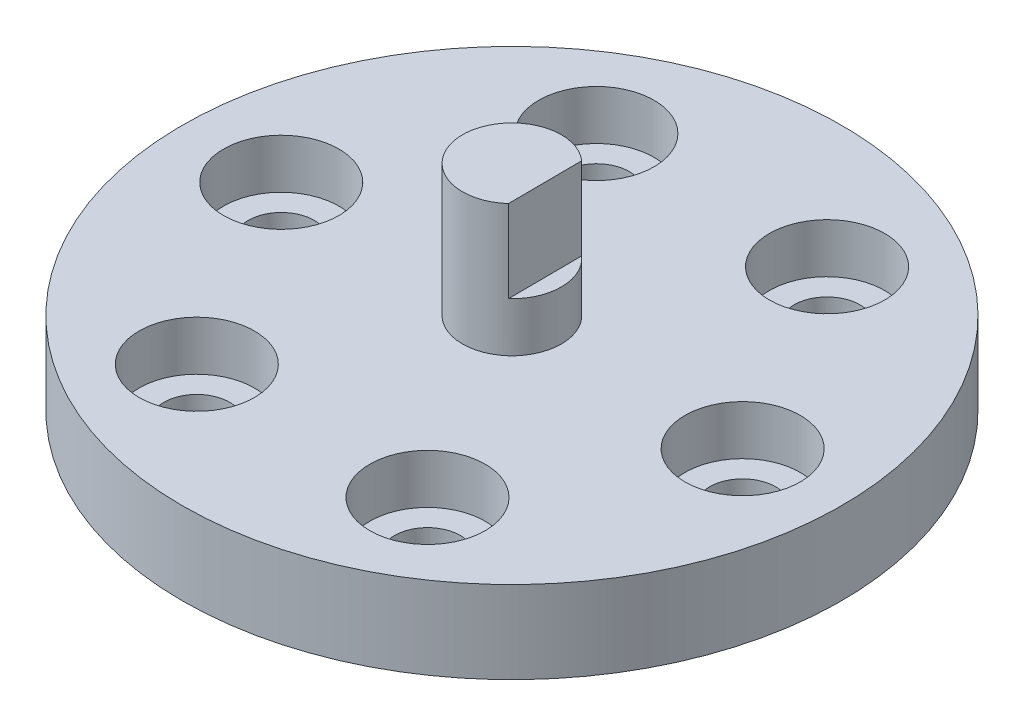
ISO-10303-21;
HEADER;
FILE_DESCRIPTION(('STEP AP214'),'2;1');
FILE_NAME('part.step','',(''),(''),'','','');
FILE_SCHEMA(('AUTOMOTIVE_DESIGN { 1 0 10303 214 1 1 1 1 }'));
ENDSEC;
DATA;
#1=APPLICATION_CONTEXT('core data for automotive mechanical design processes');
#2=APPLICATION_PROTOCOL_DEFINITION('international standard','automotive_design',2000,#1);
#3=PRODUCT_CONTEXT('',#1,'mechanical');
#4=PRODUCT('Part','Part','',(#3));
#5=PRODUCT_RELATED_PRODUCT_CATEGORY('part','',(#4));
#6=PRODUCT_DEFINITION_FORMATION('','',#4);
#7=PRODUCT_DEFINITION_CONTEXT('part definition',#1,'design');
#8=PRODUCT_DEFINITION('design','',#6,#7);
#9=PRODUCT_DEFINITION_SHAPE('','',#8);
#10=(LENGTH_UNIT() NAMED_UNIT(*) SI_UNIT(.MILLI.,.METRE.));
#11=(NAMED_UNIT(*) PLANE_ANGLE_UNIT() SI_UNIT($,.RADIAN.));
#12=(NAMED_UNIT(*) SI_UNIT($,.STERADIAN.) SOLID_ANGLE_UNIT());
#13=UNCERTAINTY_MEASURE_WITH_UNIT(LENGTH_MEASURE(1.E-05),#10,'distance_accuracy_value','');
#14=(GEOMETRIC_REPRESENTATION_CONTEXT(3) GLOBAL_UNCERTAINTY_ASSIGNED_CONTEXT((#13)) GLOBAL_UNIT_ASSIGNED_CONTEXT((#10,
#11,#12)) REPRESENTATION_CONTEXT('',''));
#15=CARTESIAN_POINT('',(0.,0.,0.));
#16=DIRECTION('',(0.,0.,1.));
#17=DIRECTION('',(1.,0.,0.));
#18=AXIS2_PLACEMENT_3D('',#15,#16,#17);
#19=CARTESIAN_POINT('',(6.99999999999997,0.,12.1243556529822));
#20=DIRECTION('',(0.,1.,0.));
#21=DIRECTION('',(0.,0.,1.));
#22=AXIS2_PLACEMENT_3D('',#19,#20,#21);
#23=CYLINDRICAL_SURFACE('',#22,2.);
#24=CARTESIAN_POINT('',(6.99999999999997,0.,12.1243556529822));
#25=DIRECTION('',(0.,1.,0.));
#26=DIRECTION('',(0.,0.,1.));
#27=AXIS2_PLACEMENT_3D('',#24,#25,#26);
#28=CIRCLE('',#27,2.);
#29=CARTESIAN_POINT('',(6.99999999999997,0.,14.1243556529822));
#30=VERTEX_POINT('',#29);
#31=EDGE_CURVE('E122',#30,#30,#28,.T.);
#32=ORIENTED_EDGE('',*,*,#31,.F.);
#33=EDGE_LOOP('',(#32));
#34=FACE_BOUND('',#33,.T.);
#35=CARTESIAN_POINT('',(6.99999999999997,2.,12.1243556529822));
#36=DIRECTION('',(0.,1.,0.));
#37=DIRECTION('',(0.,0.,1.));
#38=AXIS2_PLACEMENT_3D('',#35,#36,#37);
#39=CIRCLE('',#38,2.);
#40=CARTESIAN_POINT('',(6.99999999999997,2.,14.1243556529822));
#41=VERTEX_POINT('',#40);
#42=EDGE_CURVE('E40',#41,#41,#39,.F.);
#43=ORIENTED_EDGE('',*,*,#42,.F.);
#44=EDGE_LOOP('',(#43));
#45=FACE_BOUND('',#44,.T.);
#46=ADVANCED_FACE('F36',(#34,#45),#23,.F.);
#47=CARTESIAN_POINT('',(-7.00000000000006,0.,12.1243556529821));
#48=DIRECTION('',(0.,1.,0.));
#49=DIRECTION('',(0.,0.,1.));
#50=AXIS2_PLACEMENT_3D('',#47,#48,#49);
#51=CYLINDRICAL_SURFACE('',#50,2.);
#52=CARTESIAN_POINT('',(-7.00000000000006,0.,12.1243556529821));
#53=DIRECTION('',(0.,1.,0.));
#54=DIRECTION('',(0.,0.,1.));
#55=AXIS2_PLACEMENT_3D('',#52,#53,#54);
#56=CIRCLE('',#55,2.);
#57=CARTESIAN_POINT('',(-7.00000000000006,0.,14.1243556529821));
#58=VERTEX_POINT('',#57);
#59=EDGE_CURVE('E129',#58,#58,#56,.T.);
#60=ORIENTED_EDGE('',*,*,#59,.F.);
#61=EDGE_LOOP('',(#60));
#62=FACE_BOUND('',#61,.T.);
#63=CARTESIAN_POINT('',(-7.00000000000006,2.,12.1243556529821));
#64=DIRECTION('',(0.,1.,0.));
#65=DIRECTION('',(0.,0.,1.));
#66=AXIS2_PLACEMENT_3D('',#63,#64,#65);
#67=CIRCLE('',#66,2.);
#68=CARTESIAN_POINT('',(-7.00000000000006,2.,14.1243556529821));
#69=VERTEX_POINT('',#68);
#70=EDGE_CURVE('E151',#69,#69,#67,.F.);
#71=ORIENTED_EDGE('',*,*,#70,.F.);
#72=EDGE_LOOP('',(#71));
#73=FACE_BOUND('',#72,.T.);
#74=ADVANCED_FACE('F161',(#62,#73),#51,.F.);
#75=CARTESIAN_POINT('',(-14.,0.,0.));
#76=DIRECTION('',(0.,1.,0.));
#77=DIRECTION('',(0.,0.,1.));
#78=AXIS2_PLACEMENT_3D('',#75,#76,#77);
#79=CYLINDRICAL_SURFACE('',#78,2.);
#80=CARTESIAN_POINT('',(-14.,0.,0.));
#81=DIRECTION('',(0.,1.,0.));
#82=DIRECTION('',(0.,0.,1.));
#83=AXIS2_PLACEMENT_3D('',#80,#81,#82);
#84=CIRCLE('',#83,2.);
#85=CARTESIAN_POINT('',(-14.,0.,1.9999999999999));
#86=VERTEX_POINT('',#85);
#87=EDGE_CURVE('E132',#86,#86,#84,.T.);
#88=ORIENTED_EDGE('',*,*,#87,.F.);
#89=EDGE_LOOP('',(#88));
#90=FACE_BOUND('',#89,.T.);
#91=CARTESIAN_POINT('',(-14.,2.,0.));
#92=DIRECTION('',(0.,1.,0.));
#93=DIRECTION('',(0.,0.,1.));
#94=AXIS2_PLACEMENT_3D('',#91,#92,#93);
#95=CIRCLE('',#94,2.);
#96=CARTESIAN_POINT('',(-14.,2.,1.9999999999999));
#97=VERTEX_POINT('',#96);
#98=EDGE_CURVE('E149',#97,#97,#95,.F.);
#99=ORIENTED_EDGE('',*,*,#98,.F.);
#100=EDGE_LOOP('',(#99));
#101=FACE_BOUND('',#100,.T.);
#102=ADVANCED_FACE('F167',(#90,#101),#79,.F.);
#103=CARTESIAN_POINT('',(-6.99999999999989,0.,-12.1243556529822));
#104=DIRECTION('',(0.,1.,0.));
#105=DIRECTION('',(0.,0.,1.));
#106=AXIS2_PLACEMENT_3D('',#103,#104,#105);
#107=CYLINDRICAL_SURFACE('',#106,2.);
#108=CARTESIAN_POINT('',(-6.99999999999989,0.,-12.1243556529822));
#109=DIRECTION('',(0.,1.,0.));
#110=DIRECTION('',(0.,0.,1.));
#111=AXIS2_PLACEMENT_3D('',#108,#109,#110);
#112=CIRCLE('',#111,2.);
#113=CARTESIAN_POINT('',(-6.99999999999989,0.,-10.1243556529822));
#114=VERTEX_POINT('',#113);
#115=EDGE_CURVE('E126',#114,#114,#112,.T.);
#116=ORIENTED_EDGE('',*,*,#115,.F.);
#117=EDGE_LOOP('',(#116));
#118=FACE_BOUND('',#117,.T.);
#119=CARTESIAN_POINT('',(-6.99999999999989,2.,-12.1243556529822));
#120=DIRECTION('',(0.,1.,0.));
#121=DIRECTION('',(0.,0.,1.));
#122=AXIS2_PLACEMENT_3D('',#119,#120,#121);
#123=CIRCLE('',#122,2.);
#124=CARTESIAN_POINT('',(-6.99999999999989,2.,-10.1243556529822));
#125=VERTEX_POINT('',#124);
#126=EDGE_CURVE('E146',#125,#125,#123,.F.);
#127=ORIENTED_EDGE('',*,*,#126,.F.);
#128=EDGE_LOOP('',(#127));
#129=FACE_BOUND('',#128,.T.);
#130=ADVANCED_FACE('F177',(#118,#129),#107,.F.);
#131=CARTESIAN_POINT('',(7.00000000000014,0.,-12.1243556529821));
#132=DIRECTION('',(0.,1.,0.));
#133=DIRECTION('',(0.,0.,1.));
#134=AXIS2_PLACEMENT_3D('',#131,#132,#133);
#135=CYLINDRICAL_SURFACE('',#134,2.);
#136=CARTESIAN_POINT('',(7.00000000000014,0.,-12.1243556529821));
#137=DIRECTION('',(0.,1.,0.));
#138=DIRECTION('',(0.,0.,1.));
#139=AXIS2_PLACEMENT_3D('',#136,#137,#138);
#140=CIRCLE('',#139,2.);
#141=CARTESIAN_POINT('',(7.00000000000014,0.,-10.1243556529821));
#142=VERTEX_POINT('',#141);
#143=EDGE_CURVE('E123',#142,#142,#140,.T.);
#144=ORIENTED_EDGE('',*,*,#143,.F.);
#145=EDGE_LOOP('',(#144));
#146=FACE_BOUND('',#145,.T.);
#147=CARTESIAN_POINT('',(7.00000000000014,2.,-12.1243556529821));
#148=DIRECTION('',(0.,1.,0.));
#149=DIRECTION('',(0.,0.,1.));
#150=AXIS2_PLACEMENT_3D('',#147,#148,#149);
#151=CIRCLE('',#150,2.);
#152=CARTESIAN_POINT('',(7.00000000000014,2.,-10.1243556529821));
#153=VERTEX_POINT('',#152);
#154=EDGE_CURVE('E143',#153,#153,#151,.F.);
#155=ORIENTED_EDGE('',*,*,#154,.F.);
#156=EDGE_LOOP('',(#155));
#157=FACE_BOUND('',#156,.T.);
#158=ADVANCED_FACE('F172',(#146,#157),#135,.F.);
#159=CARTESIAN_POINT('',(14.,0.,0.));
#160=DIRECTION('',(0.,1.,0.));
#161=DIRECTION('',(0.,0.,1.));
#162=AXIS2_PLACEMENT_3D('',#159,#160,#161);
#163=CYLINDRICAL_SURFACE('',#162,2.);
#164=CARTESIAN_POINT('',(14.,0.,0.));
#165=DIRECTION('',(0.,1.,0.));
#166=DIRECTION('',(0.,0.,1.));
#167=AXIS2_PLACEMENT_3D('',#164,#165,#166);
#168=CIRCLE('',#167,2.);
#169=CARTESIAN_POINT('',(14.,0.,2.));
#170=VERTEX_POINT('',#169);
#171=EDGE_CURVE('E118',#170,#170,#168,.T.);
#172=ORIENTED_EDGE('',*,*,#171,.F.);
#173=EDGE_LOOP('',(#172));
#174=FACE_BOUND('',#173,.T.);
#175=CARTESIAN_POINT('',(14.,2.,0.));
#176=DIRECTION('',(0.,1.,0.));
#177=DIRECTION('',(0.,0.,1.));
#178=AXIS2_PLACEMENT_3D('',#175,#176,#177);
#179=CIRCLE('',#178,2.);
#180=CARTESIAN_POINT('',(14.,2.,2.));
#181=VERTEX_POINT('',#180);
#182=EDGE_CURVE('E115',#181,#181,#179,.F.);
#183=ORIENTED_EDGE('',*,*,#182,.F.);
#184=EDGE_LOOP('',(#183));
#185=FACE_BOUND('',#184,.T.);
#186=ADVANCED_FACE('F209',(#174,#185),#163,.F.);
#187=CARTESIAN_POINT('',(0.,5.,0.));
#188=DIRECTION('',(0.,-1.,0.));
#189=DIRECTION('',(0.,0.,-1.));
#190=AXIS2_PLACEMENT_3D('',#187,#188,#189);
#191=CYLINDRICAL_SURFACE('',#190,20.);
#192=CARTESIAN_POINT('',(0.,5.,0.));
#193=DIRECTION('',(0.,1.,0.));
#194=DIRECTION('',(0.,0.,1.));
#195=AXIS2_PLACEMENT_3D('',#192,#193,#194);
#196=CIRCLE('',#195,20.);
#197=CARTESIAN_POINT('',(0.,5.,20.));
#198=VERTEX_POINT('',#197);
#199=EDGE_CURVE('E45',#198,#198,#196,.T.);
#200=ORIENTED_EDGE('',*,*,#199,.F.);
#201=EDGE_LOOP('',(#200));
#202=FACE_BOUND('',#201,.T.);
#203=CARTESIAN_POINT('',(0.,0.,0.));
#204=DIRECTION('',(0.,1.,0.));
#205=DIRECTION('',(0.,0.,1.));
#206=AXIS2_PLACEMENT_3D('',#203,#204,#205);
#207=CIRCLE('',#206,20.);
#208=CARTESIAN_POINT('',(0.,0.,20.));
#209=VERTEX_POINT('',#208);
#210=EDGE_CURVE('E121',#209,#209,#207,.T.);
#211=ORIENTED_EDGE('',*,*,#210,.T.);
#212=EDGE_LOOP('',(#211));
#213=FACE_BOUND('',#212,.T.);
#214=ADVANCED_FACE('F38',(#202,#213),#191,.T.);
#215=CARTESIAN_POINT('',(0.,5.,0.));
#216=DIRECTION('',(0.,1.,0.));
#217=DIRECTION('',(0.,0.,1.));
#218=AXIS2_PLACEMENT_3D('',#215,#216,#217);
#219=PLANE('',#218);
#220=CARTESIAN_POINT('',(0.,5.,0.));
#221=DIRECTION('',(0.,1.,0.));
#222=DIRECTION('',(0.,0.,1.));
#223=AXIS2_PLACEMENT_3D('',#220,#221,#222);
#224=CIRCLE('',#223,3.);
#225=CARTESIAN_POINT('',(0.,5.,3.));
#226=VERTEX_POINT('',#225);
#227=EDGE_CURVE('E11',#226,#226,#224,.T.);
#228=ORIENTED_EDGE('',*,*,#227,.F.);
#229=EDGE_LOOP('',(#228));
#230=FACE_BOUND('',#229,.T.);
#231=CARTESIAN_POINT('',(6.99999999999997,5.,12.1243556529822));
#232=DIRECTION('',(0.,1.,0.));
#233=DIRECTION('',(0.,0.,1.));
#234=AXIS2_PLACEMENT_3D('',#231,#232,#233);
#235=CIRCLE('',#234,3.5);
#236=CARTESIAN_POINT('',(6.99999999999997,5.,15.6243556529822));
#237=VERTEX_POINT('',#236);
#238=EDGE_CURVE('E92',#237,#237,#235,.T.);
#239=ORIENTED_EDGE('',*,*,#238,.F.);
#240=EDGE_LOOP('',(#239));
#241=FACE_BOUND('',#240,.T.);
#242=CARTESIAN_POINT('',(-7.00000000000006,5.,12.1243556529821));
#243=DIRECTION('',(0.,1.,0.));
#244=DIRECTION('',(0.,0.,1.));
#245=AXIS2_PLACEMENT_3D('',#242,#243,#244);
#246=CIRCLE('',#245,3.5);
#247=CARTESIAN_POINT('',(-7.00000000000006,5.,15.6243556529821));
#248=VERTEX_POINT('',#247);
#249=EDGE_CURVE('E98',#248,#248,#246,.T.);
#250=ORIENTED_EDGE('',*,*,#249,.F.);
#251=EDGE_LOOP('',(#250));
#252=FACE_BOUND('',#251,.T.);
#253=CARTESIAN_POINT('',(-14.,5.,0.));
#254=DIRECTION('',(0.,1.,0.));
#255=DIRECTION('',(0.,0.,1.));
#256=AXIS2_PLACEMENT_3D('',#253,#254,#255);
#257=CIRCLE('',#256,3.5);
#258=CARTESIAN_POINT('',(-14.,5.,3.4999999999999));
#259=VERTEX_POINT('',#258);
#260=EDGE_CURVE('E104',#259,#259,#257,.T.);
#261=ORIENTED_EDGE('',*,*,#260,.F.);
#262=EDGE_LOOP('',(#261));
#263=FACE_BOUND('',#262,.T.);
#264=CARTESIAN_POINT('',(-6.99999999999989,5.,-12.1243556529822));
#265=DIRECTION('',(0.,1.,0.));
#266=DIRECTION('',(0.,0.,1.));
#267=AXIS2_PLACEMENT_3D('',#264,#265,#266);
#268=CIRCLE('',#267,3.5);
#269=CARTESIAN_POINT('',(-6.99999999999989,5.,-8.62435565298221));
#270=VERTEX_POINT('',#269);
#271=EDGE_CURVE('E86',#270,#270,#268,.T.);
#272=ORIENTED_EDGE('',*,*,#271,.F.);
#273=EDGE_LOOP('',(#272));
#274=FACE_BOUND('',#273,.T.);
#275=CARTESIAN_POINT('',(7.00000000000014,5.,-12.1243556529821));
#276=DIRECTION('',(0.,1.,0.));
#277=DIRECTION('',(0.,0.,1.));
#278=AXIS2_PLACEMENT_3D('',#275,#276,#277);
#279=CIRCLE('',#278,3.5);
#280=CARTESIAN_POINT('',(7.00000000000014,5.,-8.62435565298206));
#281=VERTEX_POINT('',#280);
#282=EDGE_CURVE('E78',#281,#281,#279,.T.);
#283=ORIENTED_EDGE('',*,*,#282,.F.);
#284=EDGE_LOOP('',(#283));
#285=FACE_BOUND('',#284,.T.);
#286=CARTESIAN_POINT('',(14.,5.,0.));
#287=DIRECTION('',(0.,1.,0.));
#288=DIRECTION('',(0.,0.,1.));
#289=AXIS2_PLACEMENT_3D('',#286,#287,#288);
#290=CIRCLE('',#289,3.5);
#291=CARTESIAN_POINT('',(14.,5.,3.5));
#292=VERTEX_POINT('',#291);
#293=EDGE_CURVE('E91',#292,#292,#290,.T.);
#294=ORIENTED_EDGE('',*,*,#293,.F.);
#295=EDGE_LOOP('',(#294));
#296=FACE_BOUND('',#295,.T.);
#297=ORIENTED_EDGE('',*,*,#199,.T.);
#298=EDGE_LOOP('',(#297));
#299=FACE_BOUND('',#298,.T.);
#300=ADVANCED_FACE('F182',(#230,#241,#252,#263,#274,#285,#296,#299),#219,.T.);
#301=CARTESIAN_POINT('',(0.,0.,0.));
#302=DIRECTION('',(0.,1.,0.));
#303=DIRECTION('',(0.,0.,1.));
#304=AXIS2_PLACEMENT_3D('',#301,#302,#303);
#305=PLANE('',#304);
#306=ORIENTED_EDGE('',*,*,#171,.T.);
#307=EDGE_LOOP('',(#306));
#308=FACE_BOUND('',#307,.T.);
#309=ORIENTED_EDGE('',*,*,#143,.T.);
#310=EDGE_LOOP('',(#309));
#311=FACE_BOUND('',#310,.T.);
#312=ORIENTED_EDGE('',*,*,#115,.T.);
#313=EDGE_LOOP('',(#312));
#314=FACE_BOUND('',#313,.T.);
#315=ORIENTED_EDGE('',*,*,#87,.T.);
#316=EDGE_LOOP('',(#315));
#317=FACE_BOUND('',#316,.T.);
#318=ORIENTED_EDGE('',*,*,#59,.T.);
#319=EDGE_LOOP('',(#318));
#320=FACE_BOUND('',#319,.T.);
#321=ORIENTED_EDGE('',*,*,#31,.T.);
#322=EDGE_LOOP('',(#321));
#323=FACE_BOUND('',#322,.T.);
#324=ORIENTED_EDGE('',*,*,#210,.F.);
#325=EDGE_LOOP('',(#324));
#326=FACE_BOUND('',#325,.T.);
#327=ADVANCED_FACE('F184',(#308,#311,#314,#317,#320,#323,#326),#305,.F.);
#328=CARTESIAN_POINT('',(14.,2.,0.));
#329=DIRECTION('',(0.,1.,0.));
#330=DIRECTION('',(0.,0.,1.));
#331=AXIS2_PLACEMENT_3D('',#328,#329,#330);
#332=PLANE('',#331);
#333=CARTESIAN_POINT('',(14.,2.,0.));
#334=DIRECTION('',(0.,1.,0.));
#335=DIRECTION('',(0.,0.,1.));
#336=AXIS2_PLACEMENT_3D('',#333,#334,#335);
#337=CIRCLE('',#336,3.5);
#338=CARTESIAN_POINT('',(14.,2.,3.5));
#339=VERTEX_POINT('',#338);
#340=EDGE_CURVE('E112',#339,#339,#337,.T.);
#341=ORIENTED_EDGE('',*,*,#340,.T.);
#342=EDGE_LOOP('',(#341));
#343=FACE_BOUND('',#342,.T.);
#344=ORIENTED_EDGE('',*,*,#182,.T.);
#345=EDGE_LOOP('',(#344));
#346=FACE_BOUND('',#345,.T.);
#347=ADVANCED_FACE('F187',(#343,#346),#332,.T.);
#348=CARTESIAN_POINT('',(14.,2.,0.));
#349=DIRECTION('',(0.,1.,0.));
#350=DIRECTION('',(0.,0.,1.));
#351=AXIS2_PLACEMENT_3D('',#348,#349,#350);
#352=CYLINDRICAL_SURFACE('',#351,3.5);
#353=ORIENTED_EDGE('',*,*,#340,.F.);
#354=EDGE_LOOP('',(#353));
#355=FACE_BOUND('',#354,.T.);
#356=ORIENTED_EDGE('',*,*,#293,.T.);
#357=EDGE_LOOP('',(#356));
#358=FACE_BOUND('',#357,.T.);
#359=ADVANCED_FACE('F192',(#355,#358),#352,.F.);
#360=CARTESIAN_POINT('',(7.00000000000014,2.,-12.1243556529821));
#361=DIRECTION('',(0.,1.,0.));
#362=DIRECTION('',(0.,0.,1.));
#363=AXIS2_PLACEMENT_3D('',#360,#361,#362);
#364=PLANE('',#363);
#365=CARTESIAN_POINT('',(7.00000000000014,2.,-12.1243556529821));
#366=DIRECTION('',(0.,1.,0.));
#367=DIRECTION('',(0.,0.,1.));
#368=AXIS2_PLACEMENT_3D('',#365,#366,#367);
#369=CIRCLE('',#368,3.5);
#370=CARTESIAN_POINT('',(7.00000000000014,2.,-8.62435565298206));
#371=VERTEX_POINT('',#370);
#372=EDGE_CURVE('E81',#371,#371,#369,.T.);
#373=ORIENTED_EDGE('',*,*,#372,.T.);
#374=EDGE_LOOP('',(#373));
#375=FACE_BOUND('',#374,.T.);
#376=ORIENTED_EDGE('',*,*,#154,.T.);
#377=EDGE_LOOP('',(#376));
#378=FACE_BOUND('',#377,.T.);
#379=ADVANCED_FACE('F224',(#375,#378),#364,.T.);
#380=CARTESIAN_POINT('',(7.00000000000014,2.,-12.1243556529821));
#381=DIRECTION('',(0.,1.,0.));
#382=DIRECTION('',(0.,0.,1.));
#383=AXIS2_PLACEMENT_3D('',#380,#381,#382);
#384=CYLINDRICAL_SURFACE('',#383,3.5);
#385=ORIENTED_EDGE('',*,*,#372,.F.);
#386=EDGE_LOOP('',(#385));
#387=FACE_BOUND('',#386,.T.);
#388=ORIENTED_EDGE('',*,*,#282,.T.);
#389=EDGE_LOOP('',(#388));
#390=FACE_BOUND('',#389,.T.);
#391=ADVANCED_FACE('F235',(#387,#390),#384,.F.);
#392=CARTESIAN_POINT('',(-6.99999999999989,2.,-12.1243556529822));
#393=DIRECTION('',(0.,1.,0.));
#394=DIRECTION('',(0.,0.,1.));
#395=AXIS2_PLACEMENT_3D('',#392,#393,#394);
#396=PLANE('',#395);
#397=CARTESIAN_POINT('',(-6.99999999999989,2.,-12.1243556529822));
#398=DIRECTION('',(0.,1.,0.));
#399=DIRECTION('',(0.,0.,1.));
#400=AXIS2_PLACEMENT_3D('',#397,#398,#399);
#401=CIRCLE('',#400,3.5);
#402=CARTESIAN_POINT('',(-6.99999999999989,2.,-8.62435565298221));
#403=VERTEX_POINT('',#402);
#404=EDGE_CURVE('E107',#403,#403,#401,.T.);
#405=ORIENTED_EDGE('',*,*,#404,.T.);
#406=EDGE_LOOP('',(#405));
#407=FACE_BOUND('',#406,.T.);
#408=ORIENTED_EDGE('',*,*,#126,.T.);
#409=EDGE_LOOP('',(#408));
#410=FACE_BOUND('',#409,.T.);
#411=ADVANCED_FACE('F231',(#407,#410),#396,.T.);
#412=CARTESIAN_POINT('',(-6.99999999999989,2.,-12.1243556529822));
#413=DIRECTION('',(0.,1.,0.));
#414=DIRECTION('',(0.,0.,1.));
#415=AXIS2_PLACEMENT_3D('',#412,#413,#414);
#416=CYLINDRICAL_SURFACE('',#415,3.5);
#417=ORIENTED_EDGE('',*,*,#404,.F.);
#418=EDGE_LOOP('',(#417));
#419=FACE_BOUND('',#418,.T.);
#420=ORIENTED_EDGE('',*,*,#271,.T.);
#421=EDGE_LOOP('',(#420));
#422=FACE_BOUND('',#421,.T.);
#423=ADVANCED_FACE('F227',(#419,#422),#416,.F.);
#424=CARTESIAN_POINT('',(-14.,2.,0.));
#425=DIRECTION('',(0.,1.,0.));
#426=DIRECTION('',(0.,0.,1.));
#427=AXIS2_PLACEMENT_3D('',#424,#425,#426);
#428=PLANE('',#427);
#429=CARTESIAN_POINT('',(-14.,2.,0.));
#430=DIRECTION('',(0.,1.,0.));
#431=DIRECTION('',(0.,0.,1.));
#432=AXIS2_PLACEMENT_3D('',#429,#430,#431);
#433=CIRCLE('',#432,3.5);
#434=CARTESIAN_POINT('',(-14.,2.,3.4999999999999));
#435=VERTEX_POINT('',#434);
#436=EDGE_CURVE('E101',#435,#435,#433,.T.);
#437=ORIENTED_EDGE('',*,*,#436,.T.);
#438=EDGE_LOOP('',(#437));
#439=FACE_BOUND('',#438,.T.);
#440=ORIENTED_EDGE('',*,*,#98,.T.);
#441=EDGE_LOOP('',(#440));
#442=FACE_BOUND('',#441,.T.);
#443=ADVANCED_FACE('F230',(#439,#442),#428,.T.);
#444=CARTESIAN_POINT('',(-14.,2.,0.));
#445=DIRECTION('',(0.,1.,0.));
#446=DIRECTION('',(0.,0.,1.));
#447=AXIS2_PLACEMENT_3D('',#444,#445,#446);
#448=CYLINDRICAL_SURFACE('',#447,3.5);
#449=ORIENTED_EDGE('',*,*,#436,.F.);
#450=EDGE_LOOP('',(#449));
#451=FACE_BOUND('',#450,.T.);
#452=ORIENTED_EDGE('',*,*,#260,.T.);
#453=EDGE_LOOP('',(#452));
#454=FACE_BOUND('',#453,.T.);
#455=ADVANCED_FACE('F237',(#451,#454),#448,.F.);
#456=CARTESIAN_POINT('',(-7.00000000000006,2.,12.1243556529821));
#457=DIRECTION('',(0.,1.,0.));
#458=DIRECTION('',(0.,0.,1.));
#459=AXIS2_PLACEMENT_3D('',#456,#457,#458);
#460=PLANE('',#459);
#461=CARTESIAN_POINT('',(-7.00000000000006,2.,12.1243556529821));
#462=DIRECTION('',(0.,1.,0.));
#463=DIRECTION('',(0.,0.,1.));
#464=AXIS2_PLACEMENT_3D('',#461,#462,#463);
#465=CIRCLE('',#464,3.5);
#466=CARTESIAN_POINT('',(-7.00000000000006,2.,15.6243556529821));
#467=VERTEX_POINT('',#466);
#468=EDGE_CURVE('E95',#467,#467,#465,.T.);
#469=ORIENTED_EDGE('',*,*,#468,.T.);
#470=EDGE_LOOP('',(#469));
#471=FACE_BOUND('',#470,.T.);
#472=ORIENTED_EDGE('',*,*,#70,.T.);
#473=EDGE_LOOP('',(#472));
#474=FACE_BOUND('',#473,.T.);
#475=ADVANCED_FACE('F240',(#471,#474),#460,.T.);
#476=CARTESIAN_POINT('',(-7.00000000000006,2.,12.1243556529821));
#477=DIRECTION('',(0.,1.,0.));
#478=DIRECTION('',(0.,0.,1.));
#479=AXIS2_PLACEMENT_3D('',#476,#477,#478);
#480=CYLINDRICAL_SURFACE('',#479,3.5);
#481=ORIENTED_EDGE('',*,*,#468,.F.);
#482=EDGE_LOOP('',(#481));
#483=FACE_BOUND('',#482,.T.);
#484=ORIENTED_EDGE('',*,*,#249,.T.);
#485=EDGE_LOOP('',(#484));
#486=FACE_BOUND('',#485,.T.);
#487=ADVANCED_FACE('F245',(#483,#486),#480,.F.);
#488=CARTESIAN_POINT('',(6.99999999999997,2.,12.1243556529822));
#489=DIRECTION('',(0.,1.,0.));
#490=DIRECTION('',(0.,0.,1.));
#491=AXIS2_PLACEMENT_3D('',#488,#489,#490);
#492=PLANE('',#491);
#493=CARTESIAN_POINT('',(6.99999999999997,2.,12.1243556529822));
#494=DIRECTION('',(0.,1.,0.));
#495=DIRECTION('',(0.,0.,1.));
#496=AXIS2_PLACEMENT_3D('',#493,#494,#495);
#497=CIRCLE('',#496,3.5);
#498=CARTESIAN_POINT('',(6.99999999999997,2.,15.6243556529822));
#499=VERTEX_POINT('',#498);
#500=EDGE_CURVE('E88',#499,#499,#497,.T.);
#501=ORIENTED_EDGE('',*,*,#500,.T.);
#502=EDGE_LOOP('',(#501));
#503=FACE_BOUND('',#502,.T.);
#504=ORIENTED_EDGE('',*,*,#42,.T.);
#505=EDGE_LOOP('',(#504));
#506=FACE_BOUND('',#505,.T.);
#507=ADVANCED_FACE('F158',(#503,#506),#492,.T.);
#508=CARTESIAN_POINT('',(6.99999999999997,2.,12.1243556529822));
#509=DIRECTION('',(0.,1.,0.));
#510=DIRECTION('',(0.,0.,1.));
#511=AXIS2_PLACEMENT_3D('',#508,#509,#510);
#512=CYLINDRICAL_SURFACE('',#511,3.5);
#513=ORIENTED_EDGE('',*,*,#500,.F.);
#514=EDGE_LOOP('',(#513));
#515=FACE_BOUND('',#514,.T.);
#516=ORIENTED_EDGE('',*,*,#238,.T.);
#517=EDGE_LOOP('',(#516));
#518=FACE_BOUND('',#517,.T.);
#519=ADVANCED_FACE('F252',(#515,#518),#512,.F.);
#520=CARTESIAN_POINT('',(0.,13.,0.));
#521=DIRECTION('',(0.,-1.,0.));
#522=DIRECTION('',(0.,0.,-1.));
#523=AXIS2_PLACEMENT_3D('',#520,#521,#522);
#524=CYLINDRICAL_SURFACE('',#523,3.);
#525=CARTESIAN_POINT('',(0.,13.,0.));
#526=DIRECTION('',(0.,1.,0.));
#527=DIRECTION('',(0.,0.,1.));
#528=AXIS2_PLACEMENT_3D('',#525,#526,#527);
#529=CIRCLE('',#528,3.);
#530=CARTESIAN_POINT('',(1.98538483431412,13.,-2.24905470357559));
#531=VERTEX_POINT('',#530);
#532=CARTESIAN_POINT('',(2.0145302194365,13.,2.22298627862997));
#533=VERTEX_POINT('',#532);
#534=EDGE_CURVE('E75',#531,#533,#529,.T.);
#535=ORIENTED_EDGE('',*,*,#534,.F.);
#536=DIRECTION('',(0.,1.,0.));
#537=VECTOR('',#536,1.);
#538=CARTESIAN_POINT('',(1.98538483431412,8.,-2.24905470357559));
#539=LINE('',#538,#537);
#540=CARTESIAN_POINT('',(1.98538483431412,8.,-2.24905470357559));
#541=VERTEX_POINT('',#540);
#542=EDGE_CURVE('E53',#541,#531,#539,.T.);
#543=ORIENTED_EDGE('',*,*,#542,.F.);
#544=CARTESIAN_POINT('',(0.,8.,0.));
#545=DIRECTION('',(0.,1.,0.));
#546=DIRECTION('',(0.,0.,1.));
#547=AXIS2_PLACEMENT_3D('',#544,#545,#546);
#548=CIRCLE('',#547,3.);
#549=CARTESIAN_POINT('',(2.0145302194365,8.,2.22298627862997));
#550=VERTEX_POINT('',#549);
#551=EDGE_CURVE('E69',#550,#541,#548,.T.);
#552=ORIENTED_EDGE('',*,*,#551,.F.);
#553=DIRECTION('',(0.,1.,0.));
#554=VECTOR('',#553,1.);
#555=CARTESIAN_POINT('',(2.0145302194365,8.,2.22298627862997));
#556=LINE('',#555,#554);
#557=EDGE_CURVE('E59',#550,#533,#556,.T.);
#558=ORIENTED_EDGE('',*,*,#557,.T.);
#559=EDGE_LOOP('',(#535,#543,#552,#558));
#560=FACE_BOUND('',#559,.T.);
#561=ORIENTED_EDGE('',*,*,#227,.T.);
#562=EDGE_LOOP('',(#561));
#563=FACE_BOUND('',#562,.T.);
#564=ADVANCED_FACE('F73',(#560,#563),#524,.T.);
#565=CARTESIAN_POINT('',(0.,13.,0.));
#566=DIRECTION('',(0.,1.,0.));
#567=DIRECTION('',(0.,0.,1.));
#568=AXIS2_PLACEMENT_3D('',#565,#566,#567);
#569=PLANE('',#568);
#570=DIRECTION('',(0.00651710623640578,0.,0.999978763437656));
#571=VECTOR('',#570,1.);
#572=CARTESIAN_POINT('',(2.0145302194365,13.,2.22298627862997));
#573=LINE('',#572,#571);
#574=EDGE_CURVE('E64',#531,#533,#573,.T.);
#575=ORIENTED_EDGE('',*,*,#574,.F.);
#576=ORIENTED_EDGE('',*,*,#534,.T.);
#577=EDGE_LOOP('',(#575,#576));
#578=FACE_BOUND('',#577,.T.);
#579=ADVANCED_FACE('F77',(#578),#569,.T.);
#580=CARTESIAN_POINT('',(2.0145302194365,8.,2.22298627862997));
#581=DIRECTION('',(-0.999978763437656,0.,0.00651710623640578));
#582=DIRECTION('',(0.00651710623640578,0.,0.999978763437656));
#583=AXIS2_PLACEMENT_3D('',#580,#581,#582);
#584=PLANE('',#583);
#585=ORIENTED_EDGE('',*,*,#574,.T.);
#586=ORIENTED_EDGE('',*,*,#557,.F.);
#587=DIRECTION('',(0.00651710623640578,0.,0.999978763437656));
#588=VECTOR('',#587,1.);
#589=CARTESIAN_POINT('',(2.0145302194365,8.,2.22298627862997));
#590=LINE('',#589,#588);
#591=EDGE_CURVE('E276',#541,#550,#590,.T.);
#592=ORIENTED_EDGE('',*,*,#591,.F.);
#593=ORIENTED_EDGE('',*,*,#542,.T.);
#594=EDGE_LOOP('',(#585,#586,#592,#593));
#595=FACE_BOUND('',#594,.T.);
#596=ADVANCED_FACE('F65',(#595),#584,.F.);
#597=CARTESIAN_POINT('',(0.,8.,0.));
#598=DIRECTION('',(0.,1.,0.));
#599=DIRECTION('',(0.,0.,1.));
#600=AXIS2_PLACEMENT_3D('',#597,#598,#599);
#601=PLANE('',#600);
#602=ORIENTED_EDGE('',*,*,#551,.T.);
#603=ORIENTED_EDGE('',*,*,#591,.T.);
#604=EDGE_LOOP('',(#602,#603));
#605=FACE_BOUND('',#604,.T.);
#606=ADVANCED_FACE('F271',(#605),#601,.T.);
#607=CLOSED_SHELL('',(#46,#74,#102,#130,#158,#186,#214,#300,#327,#347,#359,#379,#391,#411,#423,
#443,#455,#475,#487,#507,#519,#564,#579,#596,#606));
#608=MANIFOLD_SOLID_BREP('B2',#607);
#609=ADVANCED_BREP_SHAPE_REPRESENTATION('',(#18,#608),#14);
#610=SHAPE_DEFINITION_REPRESENTATION(#9,#609);
ENDSEC;
END-ISO-10303-21;
